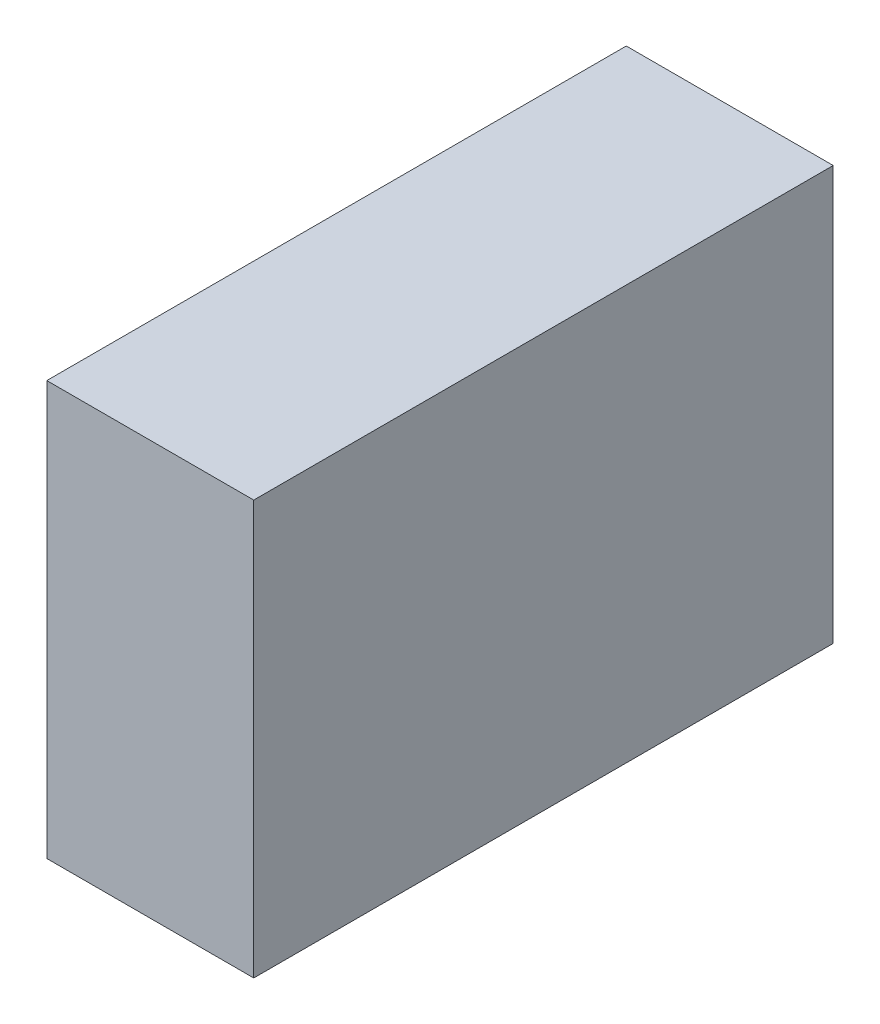
ISO-10303-21;
HEADER;
FILE_DESCRIPTION(('STEP AP214'),'2;1');
FILE_NAME('part.step','',(''),(''),'','','');
FILE_SCHEMA(('AUTOMOTIVE_DESIGN { 1 0 10303 214 1 1 1 1 }'));
ENDSEC;
DATA;
#1=APPLICATION_CONTEXT('core data for automotive mechanical design processes');
#2=APPLICATION_PROTOCOL_DEFINITION('international standard','automotive_design',2000,#1);
#3=PRODUCT_CONTEXT('',#1,'mechanical');
#4=PRODUCT('Part','Part','',(#3));
#5=PRODUCT_RELATED_PRODUCT_CATEGORY('part','',(#4));
#6=PRODUCT_DEFINITION_FORMATION('','',#4);
#7=PRODUCT_DEFINITION_CONTEXT('part definition',#1,'design');
#8=PRODUCT_DEFINITION('design','',#6,#7);
#9=PRODUCT_DEFINITION_SHAPE('','',#8);
#10=(LENGTH_UNIT() NAMED_UNIT(*) SI_UNIT(.MILLI.,.METRE.));
#11=(NAMED_UNIT(*) PLANE_ANGLE_UNIT() SI_UNIT($,.RADIAN.));
#12=(NAMED_UNIT(*) SI_UNIT($,.STERADIAN.) SOLID_ANGLE_UNIT());
#13=UNCERTAINTY_MEASURE_WITH_UNIT(LENGTH_MEASURE(1.E-05),#10,'distance_accuracy_value','');
#14=(GEOMETRIC_REPRESENTATION_CONTEXT(3) GLOBAL_UNCERTAINTY_ASSIGNED_CONTEXT((#13)) GLOBAL_UNIT_ASSIGNED_CONTEXT((#10,
#11,#12)) REPRESENTATION_CONTEXT('',''));
#15=CARTESIAN_POINT('',(0.,0.,0.));
#16=DIRECTION('',(0.,0.,1.));
#17=DIRECTION('',(1.,0.,0.));
#18=AXIS2_PLACEMENT_3D('',#15,#16,#17);
#19=CARTESIAN_POINT('',(5.45199392652661,106.287425149701,140.));
#20=DIRECTION('',(1.,0.,0.));
#21=DIRECTION('',(0.,1.,0.));
#22=AXIS2_PLACEMENT_3D('',#19,#20,#21);
#23=PLANE('',#22);
#24=DIRECTION('',(0.,-1.,0.));
#25=VECTOR('',#24,1.);
#26=CARTESIAN_POINT('',(5.45199392652661,106.287425149701,0.));
#27=LINE('',#26,#25);
#28=CARTESIAN_POINT('',(5.45199392652661,106.287425149701,0.));
#29=VERTEX_POINT('',#28);
#30=CARTESIAN_POINT('',(5.45199392652662,6.28742514970058,0.));
#31=VERTEX_POINT('',#30);
#32=EDGE_CURVE('E96',#29,#31,#27,.T.);
#33=ORIENTED_EDGE('',*,*,#32,.T.);
#34=DIRECTION('',(0.,0.,-1.));
#35=VECTOR('',#34,1.);
#36=CARTESIAN_POINT('',(5.45199392652662,6.28742514970058,140.));
#37=LINE('',#36,#35);
#38=CARTESIAN_POINT('',(5.45199392652662,6.28742514970058,140.));
#39=VERTEX_POINT('',#38);
#40=EDGE_CURVE('E11',#39,#31,#37,.T.);
#41=ORIENTED_EDGE('',*,*,#40,.F.);
#42=DIRECTION('',(0.,-1.,0.));
#43=VECTOR('',#42,1.);
#44=CARTESIAN_POINT('',(5.45199392652661,106.287425149701,140.));
#45=LINE('',#44,#43);
#46=CARTESIAN_POINT('',(5.45199392652661,106.287425149701,140.));
#47=VERTEX_POINT('',#46);
#48=EDGE_CURVE('E84',#47,#39,#45,.T.);
#49=ORIENTED_EDGE('',*,*,#48,.F.);
#50=DIRECTION('',(0.,0.,-1.));
#51=VECTOR('',#50,1.);
#52=CARTESIAN_POINT('',(5.45199392652661,106.287425149701,140.));
#53=LINE('',#52,#51);
#54=EDGE_CURVE('E92',#47,#29,#53,.T.);
#55=ORIENTED_EDGE('',*,*,#54,.T.);
#56=EDGE_LOOP('',(#33,#41,#49,#55));
#57=FACE_BOUND('',#56,.T.);
#58=ADVANCED_FACE('F33',(#57),#23,.F.);
#59=CARTESIAN_POINT('',(5.45199392652662,6.28742514970058,140.));
#60=DIRECTION('',(0.,1.,0.));
#61=DIRECTION('',(0.,0.,1.));
#62=AXIS2_PLACEMENT_3D('',#59,#60,#61);
#63=PLANE('',#62);
#64=DIRECTION('',(1.,0.,0.));
#65=VECTOR('',#64,1.);
#66=CARTESIAN_POINT('',(5.45199392652662,6.28742514970058,0.));
#67=LINE('',#66,#65);
#68=CARTESIAN_POINT('',(55.4519939265266,6.28742514970058,0.));
#69=VERTEX_POINT('',#68);
#70=EDGE_CURVE('E88',#31,#69,#67,.T.);
#71=ORIENTED_EDGE('',*,*,#70,.T.);
#72=DIRECTION('',(0.,0.,-1.));
#73=VECTOR('',#72,1.);
#74=CARTESIAN_POINT('',(55.4519939265266,6.28742514970058,140.));
#75=LINE('',#74,#73);
#76=CARTESIAN_POINT('',(55.4519939265266,6.28742514970058,140.));
#77=VERTEX_POINT('',#76);
#78=EDGE_CURVE('E41',#77,#69,#75,.T.);
#79=ORIENTED_EDGE('',*,*,#78,.F.);
#80=DIRECTION('',(1.,0.,0.));
#81=VECTOR('',#80,1.);
#82=CARTESIAN_POINT('',(5.45199392652662,6.28742514970058,140.));
#83=LINE('',#82,#81);
#84=EDGE_CURVE('E79',#39,#77,#83,.T.);
#85=ORIENTED_EDGE('',*,*,#84,.F.);
#86=ORIENTED_EDGE('',*,*,#40,.T.);
#87=EDGE_LOOP('',(#71,#79,#85,#86));
#88=FACE_BOUND('',#87,.T.);
#89=ADVANCED_FACE('F87',(#88),#63,.F.);
#90=CARTESIAN_POINT('',(55.4519939265266,106.287425149701,140.));
#91=DIRECTION('',(-1.,0.,0.));
#92=DIRECTION('',(0.,-1.,0.));
#93=AXIS2_PLACEMENT_3D('',#90,#91,#92);
#94=PLANE('',#93);
#95=DIRECTION('',(0.,1.,0.));
#96=VECTOR('',#95,1.);
#97=CARTESIAN_POINT('',(55.4519939265266,106.287425149701,0.));
#98=LINE('',#97,#96);
#99=CARTESIAN_POINT('',(55.4519939265266,106.287425149701,0.));
#100=VERTEX_POINT('',#99);
#101=EDGE_CURVE('E66',#69,#100,#98,.T.);
#102=ORIENTED_EDGE('',*,*,#101,.T.);
#103=DIRECTION('',(0.,0.,-1.));
#104=VECTOR('',#103,1.);
#105=CARTESIAN_POINT('',(55.4519939265266,106.287425149701,140.));
#106=LINE('',#105,#104);
#107=CARTESIAN_POINT('',(55.4519939265266,106.287425149701,140.));
#108=VERTEX_POINT('',#107);
#109=EDGE_CURVE('E89',#108,#100,#106,.T.);
#110=ORIENTED_EDGE('',*,*,#109,.F.);
#111=DIRECTION('',(0.,1.,0.));
#112=VECTOR('',#111,1.);
#113=CARTESIAN_POINT('',(55.4519939265266,106.287425149701,140.));
#114=LINE('',#113,#112);
#115=EDGE_CURVE('E82',#77,#108,#114,.T.);
#116=ORIENTED_EDGE('',*,*,#115,.F.);
#117=ORIENTED_EDGE('',*,*,#78,.T.);
#118=EDGE_LOOP('',(#102,#110,#116,#117));
#119=FACE_BOUND('',#118,.T.);
#120=ADVANCED_FACE('F90',(#119),#94,.F.);
#121=CARTESIAN_POINT('',(5.45199392652661,106.287425149701,140.));
#122=DIRECTION('',(0.,-1.,0.));
#123=DIRECTION('',(0.,0.,-1.));
#124=AXIS2_PLACEMENT_3D('',#121,#122,#123);
#125=PLANE('',#124);
#126=DIRECTION('',(-1.,0.,0.));
#127=VECTOR('',#126,1.);
#128=CARTESIAN_POINT('',(5.45199392652661,106.287425149701,0.));
#129=LINE('',#128,#127);
#130=EDGE_CURVE('E72',#100,#29,#129,.T.);
#131=ORIENTED_EDGE('',*,*,#130,.T.);
#132=ORIENTED_EDGE('',*,*,#54,.F.);
#133=DIRECTION('',(-1.,0.,0.));
#134=VECTOR('',#133,1.);
#135=CARTESIAN_POINT('',(5.45199392652661,106.287425149701,140.));
#136=LINE('',#135,#134);
#137=EDGE_CURVE('E49',#108,#47,#136,.T.);
#138=ORIENTED_EDGE('',*,*,#137,.F.);
#139=ORIENTED_EDGE('',*,*,#109,.T.);
#140=EDGE_LOOP('',(#131,#132,#138,#139));
#141=FACE_BOUND('',#140,.T.);
#142=ADVANCED_FACE('F103',(#141),#125,.F.);
#143=CARTESIAN_POINT('',(0.,0.,140.));
#144=DIRECTION('',(0.,0.,1.));
#145=DIRECTION('',(1.,0.,0.));
#146=AXIS2_PLACEMENT_3D('',#143,#144,#145);
#147=PLANE('',#146);
#148=ORIENTED_EDGE('',*,*,#48,.T.);
#149=ORIENTED_EDGE('',*,*,#84,.T.);
#150=ORIENTED_EDGE('',*,*,#115,.T.);
#151=ORIENTED_EDGE('',*,*,#137,.T.);
#152=EDGE_LOOP('',(#148,#149,#150,#151));
#153=FACE_BOUND('',#152,.T.);
#154=ADVANCED_FACE('F80',(#153),#147,.T.);
#155=CARTESIAN_POINT('',(0.,0.,0.));
#156=DIRECTION('',(0.,0.,1.));
#157=DIRECTION('',(1.,0.,0.));
#158=AXIS2_PLACEMENT_3D('',#155,#156,#157);
#159=PLANE('',#158);
#160=ORIENTED_EDGE('',*,*,#32,.F.);
#161=ORIENTED_EDGE('',*,*,#130,.F.);
#162=ORIENTED_EDGE('',*,*,#101,.F.);
#163=ORIENTED_EDGE('',*,*,#70,.F.);
#164=EDGE_LOOP('',(#160,#161,#162,#163));
#165=FACE_BOUND('',#164,.T.);
#166=ADVANCED_FACE('F106',(#165),#159,.F.);
#167=CLOSED_SHELL('',(#58,#89,#120,#142,#154,#166));
#168=MANIFOLD_SOLID_BREP('B2',#167);
#169=ADVANCED_BREP_SHAPE_REPRESENTATION('',(#18,#168),#14);
#170=SHAPE_DEFINITION_REPRESENTATION(#9,#169);
ENDSEC;
END-ISO-10303-21;
